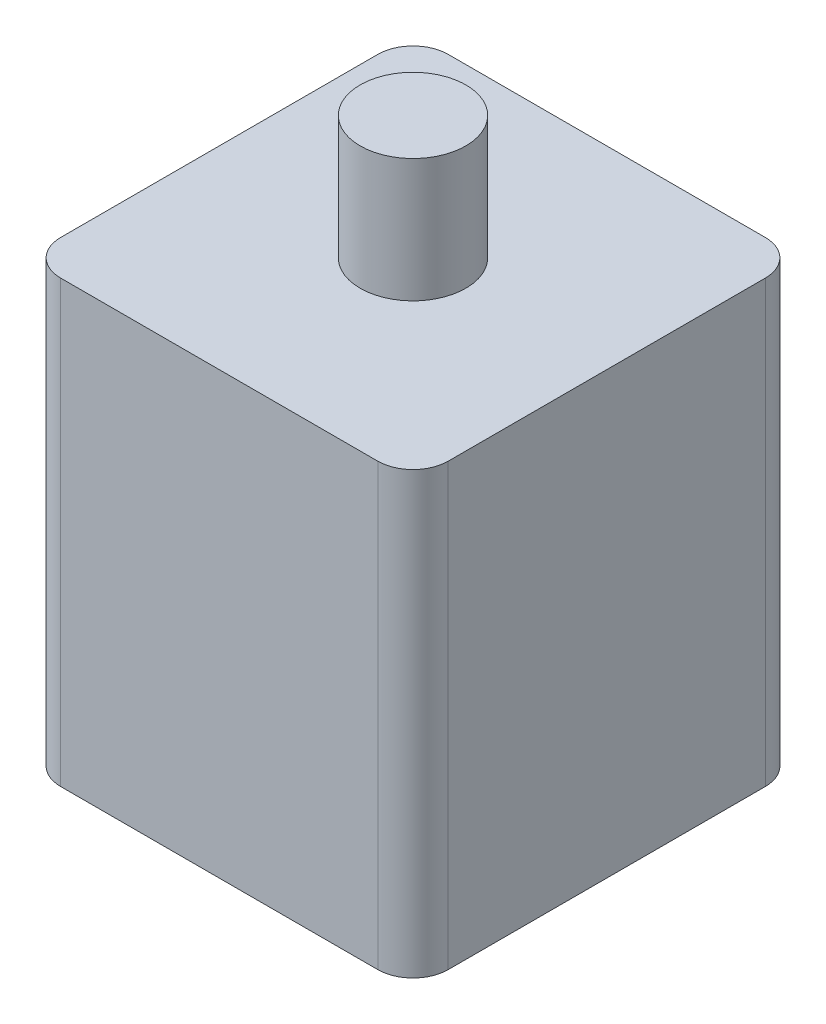
ISO-10303-21;
HEADER;
FILE_DESCRIPTION(('STEP AP214'),'2;1');
FILE_NAME('part.step','',(''),(''),'','','');
FILE_SCHEMA(('AUTOMOTIVE_DESIGN { 1 0 10303 214 1 1 1 1 }'));
ENDSEC;
DATA;
#1=APPLICATION_CONTEXT('core data for automotive mechanical design processes');
#2=APPLICATION_PROTOCOL_DEFINITION('international standard','automotive_design',2000,#1);
#3=PRODUCT_CONTEXT('',#1,'mechanical');
#4=PRODUCT('Part','Part','',(#3));
#5=PRODUCT_RELATED_PRODUCT_CATEGORY('part','',(#4));
#6=PRODUCT_DEFINITION_FORMATION('','',#4);
#7=PRODUCT_DEFINITION_CONTEXT('part definition',#1,'design');
#8=PRODUCT_DEFINITION('design','',#6,#7);
#9=PRODUCT_DEFINITION_SHAPE('','',#8);
#10=(LENGTH_UNIT() NAMED_UNIT(*) SI_UNIT(.MILLI.,.METRE.));
#11=(NAMED_UNIT(*) PLANE_ANGLE_UNIT() SI_UNIT($,.RADIAN.));
#12=(NAMED_UNIT(*) SI_UNIT($,.STERADIAN.) SOLID_ANGLE_UNIT());
#13=UNCERTAINTY_MEASURE_WITH_UNIT(LENGTH_MEASURE(1.E-05),#10,'distance_accuracy_value','');
#14=(GEOMETRIC_REPRESENTATION_CONTEXT(3) GLOBAL_UNCERTAINTY_ASSIGNED_CONTEXT((#13)) GLOBAL_UNIT_ASSIGNED_CONTEXT((#10,
#11,#12)) REPRESENTATION_CONTEXT('',''));
#15=CARTESIAN_POINT('',(0.,0.,0.));
#16=DIRECTION('',(0.,0.,1.));
#17=DIRECTION('',(1.,0.,0.));
#18=AXIS2_PLACEMENT_3D('',#15,#16,#17);
#19=CARTESIAN_POINT('',(-6.3,21.327793271037,-6.3));
#20=DIRECTION('',(0.,-1.,0.));
#21=DIRECTION('',(0.,0.,-1.));
#22=AXIS2_PLACEMENT_3D('',#19,#20,#21);
#23=CYLINDRICAL_SURFACE('',#22,1.4);
#24=CARTESIAN_POINT('',(-6.3,3.82779327103701,-6.3));
#25=DIRECTION('',(0.,1.,0.));
#26=DIRECTION('',(0.,0.,1.));
#27=AXIS2_PLACEMENT_3D('',#24,#25,#26);
#28=CIRCLE('',#27,1.4);
#29=CARTESIAN_POINT('',(-7.7,3.82779327103701,-6.29999999999999));
#30=VERTEX_POINT('',#29);
#31=CARTESIAN_POINT('',(-6.29999999999999,3.82779327103701,-7.7));
#32=VERTEX_POINT('',#31);
#33=EDGE_CURVE('E132',#30,#32,#28,.F.);
#34=ORIENTED_EDGE('',*,*,#33,.F.);
#35=DIRECTION('',(0.,-1.,0.));
#36=VECTOR('',#35,1.);
#37=CARTESIAN_POINT('',(-7.7,21.327793271037,-6.29999999999999));
#38=LINE('',#37,#36);
#39=CARTESIAN_POINT('',(-7.7,21.327793271037,-6.29999999999999));
#40=VERTEX_POINT('',#39);
#41=EDGE_CURVE('E40',#40,#30,#38,.T.);
#42=ORIENTED_EDGE('',*,*,#41,.F.);
#43=CARTESIAN_POINT('',(-6.3,21.327793271037,-6.3));
#44=DIRECTION('',(0.,1.,0.));
#45=DIRECTION('',(0.,0.,1.));
#46=AXIS2_PLACEMENT_3D('',#43,#44,#45);
#47=CIRCLE('',#46,1.4);
#48=CARTESIAN_POINT('',(-6.29999999999999,21.327793271037,-7.7));
#49=VERTEX_POINT('',#48);
#50=EDGE_CURVE('E151',#40,#49,#47,.F.);
#51=ORIENTED_EDGE('',*,*,#50,.T.);
#52=DIRECTION('',(0.,-1.,0.));
#53=VECTOR('',#52,1.);
#54=CARTESIAN_POINT('',(-6.29999999999999,21.327793271037,-7.7));
#55=LINE('',#54,#53);
#56=EDGE_CURVE('E54',#49,#32,#55,.T.);
#57=ORIENTED_EDGE('',*,*,#56,.T.);
#58=EDGE_LOOP('',(#34,#42,#51,#57));
#59=FACE_BOUND('',#58,.T.);
#60=ADVANCED_FACE('F37',(#59),#23,.T.);
#61=CARTESIAN_POINT('',(-7.7,21.327793271037,0.));
#62=DIRECTION('',(-1.,0.,0.));
#63=DIRECTION('',(0.,0.,1.));
#64=AXIS2_PLACEMENT_3D('',#61,#62,#63);
#65=PLANE('',#64);
#66=DIRECTION('',(0.,0.,-1.));
#67=VECTOR('',#66,1.);
#68=CARTESIAN_POINT('',(-7.7,3.82779327103701,0.));
#69=LINE('',#68,#67);
#70=CARTESIAN_POINT('',(-7.7,3.82779327103701,6.29999999999999));
#71=VERTEX_POINT('',#70);
#72=EDGE_CURVE('E134',#71,#30,#69,.T.);
#73=ORIENTED_EDGE('',*,*,#72,.F.);
#74=DIRECTION('',(0.,-1.,0.));
#75=VECTOR('',#74,1.);
#76=CARTESIAN_POINT('',(-7.7,21.327793271037,6.29999999999999));
#77=LINE('',#76,#75);
#78=CARTESIAN_POINT('',(-7.7,21.327793271037,6.29999999999999));
#79=VERTEX_POINT('',#78);
#80=EDGE_CURVE('E159',#79,#71,#77,.T.);
#81=ORIENTED_EDGE('',*,*,#80,.F.);
#82=DIRECTION('',(0.,0.,-1.));
#83=VECTOR('',#82,1.);
#84=CARTESIAN_POINT('',(-7.7,21.327793271037,0.));
#85=LINE('',#84,#83);
#86=EDGE_CURVE('E168',#79,#40,#85,.T.);
#87=ORIENTED_EDGE('',*,*,#86,.T.);
#88=ORIENTED_EDGE('',*,*,#41,.T.);
#89=EDGE_LOOP('',(#73,#81,#87,#88));
#90=FACE_BOUND('',#89,.T.);
#91=ADVANCED_FACE('F166',(#90),#65,.T.);
#92=CARTESIAN_POINT('',(-6.3,21.327793271037,6.3));
#93=DIRECTION('',(0.,-1.,0.));
#94=DIRECTION('',(0.,0.,-1.));
#95=AXIS2_PLACEMENT_3D('',#92,#93,#94);
#96=CYLINDRICAL_SURFACE('',#95,1.4);
#97=CARTESIAN_POINT('',(-6.3,3.82779327103701,6.3));
#98=DIRECTION('',(0.,1.,0.));
#99=DIRECTION('',(0.,0.,1.));
#100=AXIS2_PLACEMENT_3D('',#97,#98,#99);
#101=CIRCLE('',#100,1.4);
#102=CARTESIAN_POINT('',(-6.29999999999999,3.82779327103701,7.7));
#103=VERTEX_POINT('',#102);
#104=EDGE_CURVE('E138',#103,#71,#101,.F.);
#105=ORIENTED_EDGE('',*,*,#104,.F.);
#106=DIRECTION('',(0.,-1.,0.));
#107=VECTOR('',#106,1.);
#108=CARTESIAN_POINT('',(-6.29999999999999,21.327793271037,7.7));
#109=LINE('',#108,#107);
#110=CARTESIAN_POINT('',(-6.29999999999999,21.327793271037,7.7));
#111=VERTEX_POINT('',#110);
#112=EDGE_CURVE('E158',#111,#103,#109,.T.);
#113=ORIENTED_EDGE('',*,*,#112,.F.);
#114=CARTESIAN_POINT('',(-6.3,21.327793271037,6.3));
#115=DIRECTION('',(0.,1.,0.));
#116=DIRECTION('',(0.,0.,1.));
#117=AXIS2_PLACEMENT_3D('',#114,#115,#116);
#118=CIRCLE('',#117,1.4);
#119=EDGE_CURVE('E176',#111,#79,#118,.F.);
#120=ORIENTED_EDGE('',*,*,#119,.T.);
#121=ORIENTED_EDGE('',*,*,#80,.T.);
#122=EDGE_LOOP('',(#105,#113,#120,#121));
#123=FACE_BOUND('',#122,.T.);
#124=ADVANCED_FACE('F173',(#123),#96,.T.);
#125=CARTESIAN_POINT('',(0.,21.327793271037,7.7));
#126=DIRECTION('',(0.,0.,-1.));
#127=DIRECTION('',(-1.,0.,0.));
#128=AXIS2_PLACEMENT_3D('',#125,#126,#127);
#129=PLANE('',#128);
#130=DIRECTION('',(1.,0.,0.));
#131=VECTOR('',#130,1.);
#132=CARTESIAN_POINT('',(0.,3.82779327103701,7.7));
#133=LINE('',#132,#131);
#134=CARTESIAN_POINT('',(6.29999999999999,3.82779327103701,7.7));
#135=VERTEX_POINT('',#134);
#136=EDGE_CURVE('E141',#103,#135,#133,.T.);
#137=ORIENTED_EDGE('',*,*,#136,.T.);
#138=DIRECTION('',(0.,-1.,0.));
#139=VECTOR('',#138,1.);
#140=CARTESIAN_POINT('',(6.29999999999999,21.327793271037,7.7));
#141=LINE('',#140,#139);
#142=CARTESIAN_POINT('',(6.29999999999999,21.327793271037,7.7));
#143=VERTEX_POINT('',#142);
#144=EDGE_CURVE('E155',#143,#135,#141,.T.);
#145=ORIENTED_EDGE('',*,*,#144,.F.);
#146=DIRECTION('',(1.,0.,0.));
#147=VECTOR('',#146,1.);
#148=CARTESIAN_POINT('',(0.,21.327793271037,7.7));
#149=LINE('',#148,#147);
#150=EDGE_CURVE('E179',#111,#143,#149,.T.);
#151=ORIENTED_EDGE('',*,*,#150,.F.);
#152=ORIENTED_EDGE('',*,*,#112,.T.);
#153=EDGE_LOOP('',(#137,#145,#151,#152));
#154=FACE_BOUND('',#153,.T.);
#155=ADVANCED_FACE('F180',(#154),#129,.F.);
#156=CARTESIAN_POINT('',(6.3,21.327793271037,6.3));
#157=DIRECTION('',(0.,-1.,0.));
#158=DIRECTION('',(0.,0.,-1.));
#159=AXIS2_PLACEMENT_3D('',#156,#157,#158);
#160=CYLINDRICAL_SURFACE('',#159,1.4);
#161=CARTESIAN_POINT('',(6.3,3.82779327103701,6.3));
#162=DIRECTION('',(0.,1.,0.));
#163=DIRECTION('',(0.,0.,1.));
#164=AXIS2_PLACEMENT_3D('',#161,#162,#163);
#165=CIRCLE('',#164,1.4);
#166=CARTESIAN_POINT('',(7.7,3.82779327103701,6.29999999999999));
#167=VERTEX_POINT('',#166);
#168=EDGE_CURVE('E143',#135,#167,#165,.T.);
#169=ORIENTED_EDGE('',*,*,#168,.T.);
#170=DIRECTION('',(0.,-1.,0.));
#171=VECTOR('',#170,1.);
#172=CARTESIAN_POINT('',(7.7,21.327793271037,6.29999999999999));
#173=LINE('',#172,#171);
#174=CARTESIAN_POINT('',(7.7,21.327793271037,6.29999999999999));
#175=VERTEX_POINT('',#174);
#176=EDGE_CURVE('E124',#175,#167,#173,.T.);
#177=ORIENTED_EDGE('',*,*,#176,.F.);
#178=CARTESIAN_POINT('',(6.3,21.327793271037,6.3));
#179=DIRECTION('',(0.,1.,0.));
#180=DIRECTION('',(0.,0.,1.));
#181=AXIS2_PLACEMENT_3D('',#178,#179,#180);
#182=CIRCLE('',#181,1.4);
#183=EDGE_CURVE('E112',#143,#175,#182,.T.);
#184=ORIENTED_EDGE('',*,*,#183,.F.);
#185=ORIENTED_EDGE('',*,*,#144,.T.);
#186=EDGE_LOOP('',(#169,#177,#184,#185));
#187=FACE_BOUND('',#186,.T.);
#188=ADVANCED_FACE('F217',(#187),#160,.T.);
#189=CARTESIAN_POINT('',(7.7,21.327793271037,0.));
#190=DIRECTION('',(-1.,0.,0.));
#191=DIRECTION('',(0.,0.,1.));
#192=AXIS2_PLACEMENT_3D('',#189,#190,#191);
#193=PLANE('',#192);
#194=DIRECTION('',(0.,0.,-1.));
#195=VECTOR('',#194,1.);
#196=CARTESIAN_POINT('',(7.7,3.82779327103701,0.));
#197=LINE('',#196,#195);
#198=CARTESIAN_POINT('',(7.7,3.82779327103701,-6.29999999999999));
#199=VERTEX_POINT('',#198);
#200=EDGE_CURVE('E121',#167,#199,#197,.T.);
#201=ORIENTED_EDGE('',*,*,#200,.T.);
#202=DIRECTION('',(0.,-1.,0.));
#203=VECTOR('',#202,1.);
#204=CARTESIAN_POINT('',(7.7,21.327793271037,-6.29999999999999));
#205=LINE('',#204,#203);
#206=CARTESIAN_POINT('',(7.7,21.327793271037,-6.29999999999999));
#207=VERTEX_POINT('',#206);
#208=EDGE_CURVE('E118',#207,#199,#205,.T.);
#209=ORIENTED_EDGE('',*,*,#208,.F.);
#210=DIRECTION('',(0.,0.,-1.));
#211=VECTOR('',#210,1.);
#212=CARTESIAN_POINT('',(7.7,21.327793271037,0.));
#213=LINE('',#212,#211);
#214=EDGE_CURVE('E105',#175,#207,#213,.T.);
#215=ORIENTED_EDGE('',*,*,#214,.F.);
#216=ORIENTED_EDGE('',*,*,#176,.T.);
#217=EDGE_LOOP('',(#201,#209,#215,#216));
#218=FACE_BOUND('',#217,.T.);
#219=ADVANCED_FACE('F119',(#218),#193,.F.);
#220=CARTESIAN_POINT('',(6.3,21.327793271037,-6.3));
#221=DIRECTION('',(0.,-1.,0.));
#222=DIRECTION('',(0.,0.,-1.));
#223=AXIS2_PLACEMENT_3D('',#220,#221,#222);
#224=CYLINDRICAL_SURFACE('',#223,1.4);
#225=CARTESIAN_POINT('',(6.3,3.82779327103701,-6.3));
#226=DIRECTION('',(0.,1.,0.));
#227=DIRECTION('',(0.,0.,1.));
#228=AXIS2_PLACEMENT_3D('',#225,#226,#227);
#229=CIRCLE('',#228,1.4);
#230=CARTESIAN_POINT('',(6.29999999999999,3.82779327103701,-7.7));
#231=VERTEX_POINT('',#230);
#232=EDGE_CURVE('E146',#231,#199,#229,.F.);
#233=ORIENTED_EDGE('',*,*,#232,.F.);
#234=DIRECTION('',(0.,-1.,0.));
#235=VECTOR('',#234,1.);
#236=CARTESIAN_POINT('',(6.29999999999999,21.327793271037,-7.7));
#237=LINE('',#236,#235);
#238=CARTESIAN_POINT('',(6.29999999999999,21.327793271037,-7.7));
#239=VERTEX_POINT('',#238);
#240=EDGE_CURVE('E80',#239,#231,#237,.T.);
#241=ORIENTED_EDGE('',*,*,#240,.F.);
#242=CARTESIAN_POINT('',(6.3,21.327793271037,-6.3));
#243=DIRECTION('',(0.,1.,0.));
#244=DIRECTION('',(0.,0.,1.));
#245=AXIS2_PLACEMENT_3D('',#242,#243,#244);
#246=CIRCLE('',#245,1.4);
#247=EDGE_CURVE('E110',#239,#207,#246,.F.);
#248=ORIENTED_EDGE('',*,*,#247,.T.);
#249=ORIENTED_EDGE('',*,*,#208,.T.);
#250=EDGE_LOOP('',(#233,#241,#248,#249));
#251=FACE_BOUND('',#250,.T.);
#252=ADVANCED_FACE('F126',(#251),#224,.T.);
#253=CARTESIAN_POINT('',(0.,21.327793271037,-7.7));
#254=DIRECTION('',(0.,0.,-1.));
#255=DIRECTION('',(-1.,0.,0.));
#256=AXIS2_PLACEMENT_3D('',#253,#254,#255);
#257=PLANE('',#256);
#258=DIRECTION('',(1.,0.,0.));
#259=VECTOR('',#258,1.);
#260=CARTESIAN_POINT('',(0.,3.82779327103701,-7.7));
#261=LINE('',#260,#259);
#262=EDGE_CURVE('E148',#32,#231,#261,.T.);
#263=ORIENTED_EDGE('',*,*,#262,.F.);
#264=ORIENTED_EDGE('',*,*,#56,.F.);
#265=DIRECTION('',(1.,0.,0.));
#266=VECTOR('',#265,1.);
#267=CARTESIAN_POINT('',(0.,21.327793271037,-7.7));
#268=LINE('',#267,#266);
#269=EDGE_CURVE('E127',#49,#239,#268,.T.);
#270=ORIENTED_EDGE('',*,*,#269,.T.);
#271=ORIENTED_EDGE('',*,*,#240,.T.);
#272=EDGE_LOOP('',(#263,#264,#270,#271));
#273=FACE_BOUND('',#272,.T.);
#274=ADVANCED_FACE('F198',(#273),#257,.T.);
#275=CARTESIAN_POINT('',(0.,21.327793271037,0.));
#276=DIRECTION('',(0.,1.,0.));
#277=DIRECTION('',(0.,0.,1.));
#278=AXIS2_PLACEMENT_3D('',#275,#276,#277);
#279=PLANE('',#278);
#280=CARTESIAN_POINT('',(0.,21.327793271037,0.));
#281=DIRECTION('',(0.,1.,0.));
#282=DIRECTION('',(0.,0.,1.));
#283=AXIS2_PLACEMENT_3D('',#280,#281,#282);
#284=CIRCLE('',#283,2.1);
#285=CARTESIAN_POINT('',(0.,21.327793271037,2.1));
#286=VERTEX_POINT('',#285);
#287=EDGE_CURVE('E11',#286,#286,#284,.T.);
#288=ORIENTED_EDGE('',*,*,#287,.F.);
#289=EDGE_LOOP('',(#288));
#290=FACE_BOUND('',#289,.T.);
#291=ORIENTED_EDGE('',*,*,#50,.F.);
#292=ORIENTED_EDGE('',*,*,#86,.F.);
#293=ORIENTED_EDGE('',*,*,#119,.F.);
#294=ORIENTED_EDGE('',*,*,#150,.T.);
#295=ORIENTED_EDGE('',*,*,#183,.T.);
#296=ORIENTED_EDGE('',*,*,#214,.T.);
#297=ORIENTED_EDGE('',*,*,#247,.F.);
#298=ORIENTED_EDGE('',*,*,#269,.F.);
#299=EDGE_LOOP('',(#291,#292,#293,#294,#295,#296,#297,#298));
#300=FACE_BOUND('',#299,.T.);
#301=ADVANCED_FACE('F107',(#290,#300),#279,.T.);
#302=CARTESIAN_POINT('',(0.,3.82779327103701,0.));
#303=DIRECTION('',(0.,1.,0.));
#304=DIRECTION('',(0.,0.,1.));
#305=AXIS2_PLACEMENT_3D('',#302,#303,#304);
#306=PLANE('',#305);
#307=ORIENTED_EDGE('',*,*,#33,.T.);
#308=ORIENTED_EDGE('',*,*,#262,.T.);
#309=ORIENTED_EDGE('',*,*,#232,.T.);
#310=ORIENTED_EDGE('',*,*,#200,.F.);
#311=ORIENTED_EDGE('',*,*,#168,.F.);
#312=ORIENTED_EDGE('',*,*,#136,.F.);
#313=ORIENTED_EDGE('',*,*,#104,.T.);
#314=ORIENTED_EDGE('',*,*,#72,.T.);
#315=EDGE_LOOP('',(#307,#308,#309,#310,#311,#312,#313,#314));
#316=FACE_BOUND('',#315,.T.);
#317=ADVANCED_FACE('F170',(#316),#306,.F.);
#318=CARTESIAN_POINT('',(0.,26.227793271037,0.));
#319=DIRECTION('',(0.,-1.,0.));
#320=DIRECTION('',(0.,0.,-1.));
#321=AXIS2_PLACEMENT_3D('',#318,#319,#320);
#322=CYLINDRICAL_SURFACE('',#321,2.1);
#323=CARTESIAN_POINT('',(0.,26.227793271037,0.));
#324=DIRECTION('',(0.,1.,0.));
#325=DIRECTION('',(0.,0.,1.));
#326=AXIS2_PLACEMENT_3D('',#323,#324,#325);
#327=CIRCLE('',#326,2.1);
#328=CARTESIAN_POINT('',(0.,26.227793271037,2.1));
#329=VERTEX_POINT('',#328);
#330=EDGE_CURVE('E135',#329,#329,#327,.T.);
#331=ORIENTED_EDGE('',*,*,#330,.F.);
#332=EDGE_LOOP('',(#331));
#333=FACE_BOUND('',#332,.T.);
#334=ORIENTED_EDGE('',*,*,#287,.T.);
#335=EDGE_LOOP('',(#334));
#336=FACE_BOUND('',#335,.T.);
#337=ADVANCED_FACE('F191',(#333,#336),#322,.T.);
#338=CARTESIAN_POINT('',(0.,26.227793271037,0.));
#339=DIRECTION('',(0.,1.,0.));
#340=DIRECTION('',(0.,0.,1.));
#341=AXIS2_PLACEMENT_3D('',#338,#339,#340);
#342=PLANE('',#341);
#343=ORIENTED_EDGE('',*,*,#330,.T.);
#344=EDGE_LOOP('',(#343));
#345=FACE_BOUND('',#344,.T.);
#346=ADVANCED_FACE('F189',(#345),#342,.T.);
#347=CLOSED_SHELL('',(#60,#91,#124,#155,#188,#219,#252,#274,#301,#317,#337,#346));
#348=MANIFOLD_SOLID_BREP('B2',#347);
#349=ADVANCED_BREP_SHAPE_REPRESENTATION('',(#18,#348),#14);
#350=SHAPE_DEFINITION_REPRESENTATION(#9,#349);
ENDSEC;
END-ISO-10303-21;
